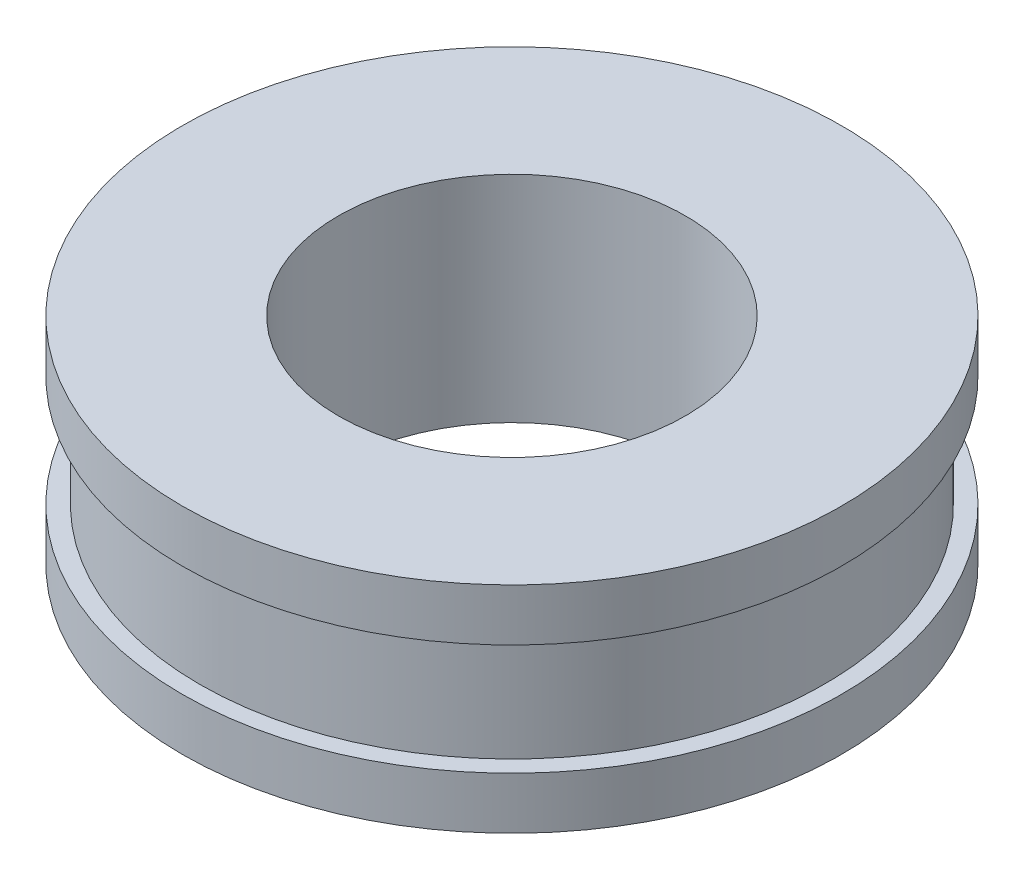
ISO-10303-21;
HEADER;
FILE_DESCRIPTION(('STEP AP214'),'2;1');
FILE_NAME('part.step','',(''),(''),'','','');
FILE_SCHEMA(('AUTOMOTIVE_DESIGN { 1 0 10303 214 1 1 1 1 }'));
ENDSEC;
DATA;
#1=APPLICATION_CONTEXT('core data for automotive mechanical design processes');
#2=APPLICATION_PROTOCOL_DEFINITION('international standard','automotive_design',2000,#1);
#3=PRODUCT_CONTEXT('',#1,'mechanical');
#4=PRODUCT('Part','Part','',(#3));
#5=PRODUCT_RELATED_PRODUCT_CATEGORY('part','',(#4));
#6=PRODUCT_DEFINITION_FORMATION('','',#4);
#7=PRODUCT_DEFINITION_CONTEXT('part definition',#1,'design');
#8=PRODUCT_DEFINITION('design','',#6,#7);
#9=PRODUCT_DEFINITION_SHAPE('','',#8);
#10=(LENGTH_UNIT() NAMED_UNIT(*) SI_UNIT(.MILLI.,.METRE.));
#11=(NAMED_UNIT(*) PLANE_ANGLE_UNIT() SI_UNIT($,.RADIAN.));
#12=(NAMED_UNIT(*) SI_UNIT($,.STERADIAN.) SOLID_ANGLE_UNIT());
#13=UNCERTAINTY_MEASURE_WITH_UNIT(LENGTH_MEASURE(1.E-05),#10,'distance_accuracy_value','');
#14=(GEOMETRIC_REPRESENTATION_CONTEXT(3) GLOBAL_UNCERTAINTY_ASSIGNED_CONTEXT((#13)) GLOBAL_UNIT_ASSIGNED_CONTEXT((#10,
#11,#12)) REPRESENTATION_CONTEXT('',''));
#15=CARTESIAN_POINT('',(0.,0.,0.));
#16=DIRECTION('',(0.,0.,1.));
#17=DIRECTION('',(1.,0.,0.));
#18=AXIS2_PLACEMENT_3D('',#15,#16,#17);
#19=CARTESIAN_POINT('',(0.,15.5,0.));
#20=DIRECTION('',(0.,-1.,0.));
#21=DIRECTION('',(0.,0.,-1.));
#22=AXIS2_PLACEMENT_3D('',#19,#20,#21);
#23=CYLINDRICAL_SURFACE('',#22,47.5);
#24=CARTESIAN_POINT('',(0.,-15.5,0.));
#25=DIRECTION('',(0.,1.,0.));
#26=DIRECTION('',(0.,0.,1.));
#27=AXIS2_PLACEMENT_3D('',#24,#25,#26);
#28=CIRCLE('',#27,47.5);
#29=CARTESIAN_POINT('',(0.,-15.5,47.5));
#30=VERTEX_POINT('',#29);
#31=EDGE_CURVE('E35',#30,#30,#28,.T.);
#32=ORIENTED_EDGE('',*,*,#31,.T.);
#33=EDGE_LOOP('',(#32));
#34=FACE_BOUND('',#33,.T.);
#35=CARTESIAN_POINT('',(0.,-8.,0.));
#36=DIRECTION('',(0.,1.,0.));
#37=DIRECTION('',(0.,0.,1.));
#38=AXIS2_PLACEMENT_3D('',#35,#36,#37);
#39=CIRCLE('',#38,47.5);
#40=CARTESIAN_POINT('',(0.,-8.,47.5));
#41=VERTEX_POINT('',#40);
#42=EDGE_CURVE('E47',#41,#41,#39,.T.);
#43=ORIENTED_EDGE('',*,*,#42,.F.);
#44=EDGE_LOOP('',(#43));
#45=FACE_BOUND('',#44,.T.);
#46=ADVANCED_FACE('F31',(#34,#45),#23,.T.);
#47=CARTESIAN_POINT('',(0.,15.5,0.));
#48=DIRECTION('',(0.,1.,0.));
#49=DIRECTION('',(0.,0.,1.));
#50=AXIS2_PLACEMENT_3D('',#47,#48,#49);
#51=PLANE('',#50);
#52=CARTESIAN_POINT('',(0.,15.5,0.));
#53=DIRECTION('',(0.,1.,0.));
#54=DIRECTION('',(0.,0.,1.));
#55=AXIS2_PLACEMENT_3D('',#52,#53,#54);
#56=CIRCLE('',#55,47.5);
#57=CARTESIAN_POINT('',(0.,15.5,47.5));
#58=VERTEX_POINT('',#57);
#59=EDGE_CURVE('E10',#58,#58,#56,.T.);
#60=ORIENTED_EDGE('',*,*,#59,.T.);
#61=EDGE_LOOP('',(#60));
#62=FACE_BOUND('',#61,.T.);
#63=CARTESIAN_POINT('',(0.,15.5,0.));
#64=DIRECTION('',(0.,1.,0.));
#65=DIRECTION('',(0.,0.,1.));
#66=AXIS2_PLACEMENT_3D('',#63,#64,#65);
#67=CIRCLE('',#66,25.);
#68=CARTESIAN_POINT('',(0.,15.5,25.));
#69=VERTEX_POINT('',#68);
#70=EDGE_CURVE('E42',#69,#69,#67,.T.);
#71=ORIENTED_EDGE('',*,*,#70,.F.);
#72=EDGE_LOOP('',(#71));
#73=FACE_BOUND('',#72,.T.);
#74=ADVANCED_FACE('F74',(#62,#73),#51,.T.);
#75=CARTESIAN_POINT('',(0.,-15.5,0.));
#76=DIRECTION('',(0.,1.,0.));
#77=DIRECTION('',(0.,0.,1.));
#78=AXIS2_PLACEMENT_3D('',#75,#76,#77);
#79=PLANE('',#78);
#80=ORIENTED_EDGE('',*,*,#31,.F.);
#81=EDGE_LOOP('',(#80));
#82=FACE_BOUND('',#81,.T.);
#83=CARTESIAN_POINT('',(0.,-15.5,0.));
#84=DIRECTION('',(0.,1.,0.));
#85=DIRECTION('',(0.,0.,1.));
#86=AXIS2_PLACEMENT_3D('',#83,#84,#85);
#87=CIRCLE('',#86,25.);
#88=CARTESIAN_POINT('',(0.,-15.5,25.));
#89=VERTEX_POINT('',#88);
#90=EDGE_CURVE('E44',#89,#89,#87,.T.);
#91=ORIENTED_EDGE('',*,*,#90,.T.);
#92=EDGE_LOOP('',(#91));
#93=FACE_BOUND('',#92,.T.);
#94=ADVANCED_FACE('F79',(#82,#93),#79,.F.);
#95=CARTESIAN_POINT('',(0.,8.,0.));
#96=DIRECTION('',(0.,1.,0.));
#97=DIRECTION('',(0.,0.,1.));
#98=AXIS2_PLACEMENT_3D('',#95,#96,#97);
#99=CIRCLE('',#98,47.5);
#100=CARTESIAN_POINT('',(0.,8.,47.5));
#101=VERTEX_POINT('',#100);
#102=EDGE_CURVE('E50',#101,#101,#99,.T.);
#103=ORIENTED_EDGE('',*,*,#102,.T.);
#104=EDGE_LOOP('',(#103));
#105=FACE_BOUND('',#104,.T.);
#106=ORIENTED_EDGE('',*,*,#59,.F.);
#107=EDGE_LOOP('',(#106));
#108=FACE_BOUND('',#107,.T.);
#109=ADVANCED_FACE('F33',(#105,#108),#23,.T.);
#110=CARTESIAN_POINT('',(0.,15.5,0.));
#111=DIRECTION('',(0.,-1.,0.));
#112=DIRECTION('',(0.,0.,-1.));
#113=AXIS2_PLACEMENT_3D('',#110,#111,#112);
#114=CYLINDRICAL_SURFACE('',#113,25.);
#115=ORIENTED_EDGE('',*,*,#70,.T.);
#116=EDGE_LOOP('',(#115));
#117=FACE_BOUND('',#116,.T.);
#118=ORIENTED_EDGE('',*,*,#90,.F.);
#119=EDGE_LOOP('',(#118));
#120=FACE_BOUND('',#119,.T.);
#121=ADVANCED_FACE('F69',(#117,#120),#114,.F.);
#122=CARTESIAN_POINT('',(0.,-8.,0.));
#123=DIRECTION('',(0.,1.,0.));
#124=DIRECTION('',(0.,0.,1.));
#125=AXIS2_PLACEMENT_3D('',#122,#123,#124);
#126=PLANE('',#125);
#127=CARTESIAN_POINT('',(0.,-8.,0.));
#128=DIRECTION('',(0.,1.,0.));
#129=DIRECTION('',(0.,0.,1.));
#130=AXIS2_PLACEMENT_3D('',#127,#128,#129);
#131=CIRCLE('',#130,45.);
#132=CARTESIAN_POINT('',(0.,-8.,45.));
#133=VERTEX_POINT('',#132);
#134=EDGE_CURVE('E53',#133,#133,#131,.T.);
#135=ORIENTED_EDGE('',*,*,#134,.F.);
#136=EDGE_LOOP('',(#135));
#137=FACE_BOUND('',#136,.T.);
#138=ORIENTED_EDGE('',*,*,#42,.T.);
#139=EDGE_LOOP('',(#138));
#140=FACE_BOUND('',#139,.T.);
#141=ADVANCED_FACE('F65',(#137,#140),#126,.T.);
#142=CARTESIAN_POINT('',(0.,8.,0.));
#143=DIRECTION('',(0.,1.,0.));
#144=DIRECTION('',(0.,0.,1.));
#145=AXIS2_PLACEMENT_3D('',#142,#143,#144);
#146=PLANE('',#145);
#147=CARTESIAN_POINT('',(0.,8.,0.));
#148=DIRECTION('',(0.,1.,0.));
#149=DIRECTION('',(0.,0.,1.));
#150=AXIS2_PLACEMENT_3D('',#147,#148,#149);
#151=CIRCLE('',#150,45.);
#152=CARTESIAN_POINT('',(0.,8.,45.));
#153=VERTEX_POINT('',#152);
#154=EDGE_CURVE('E56',#153,#153,#151,.T.);
#155=ORIENTED_EDGE('',*,*,#154,.T.);
#156=EDGE_LOOP('',(#155));
#157=FACE_BOUND('',#156,.T.);
#158=ORIENTED_EDGE('',*,*,#102,.F.);
#159=EDGE_LOOP('',(#158));
#160=FACE_BOUND('',#159,.T.);
#161=ADVANCED_FACE('F68',(#157,#160),#146,.F.);
#162=CARTESIAN_POINT('',(0.,-8.,0.));
#163=DIRECTION('',(0.,1.,0.));
#164=DIRECTION('',(0.,0.,1.));
#165=AXIS2_PLACEMENT_3D('',#162,#163,#164);
#166=CYLINDRICAL_SURFACE('',#165,45.);
#167=ORIENTED_EDGE('',*,*,#134,.T.);
#168=EDGE_LOOP('',(#167));
#169=FACE_BOUND('',#168,.T.);
#170=ORIENTED_EDGE('',*,*,#154,.F.);
#171=EDGE_LOOP('',(#170));
#172=FACE_BOUND('',#171,.T.);
#173=ADVANCED_FACE('F62',(#169,#172),#166,.T.);
#174=CLOSED_SHELL('',(#46,#74,#94,#109,#121,#141,#161,#173));
#175=MANIFOLD_SOLID_BREP('B2',#174);
#176=ADVANCED_BREP_SHAPE_REPRESENTATION('',(#18,#175),#14);
#177=SHAPE_DEFINITION_REPRESENTATION(#9,#176);
ENDSEC;
END-ISO-10303-21;
